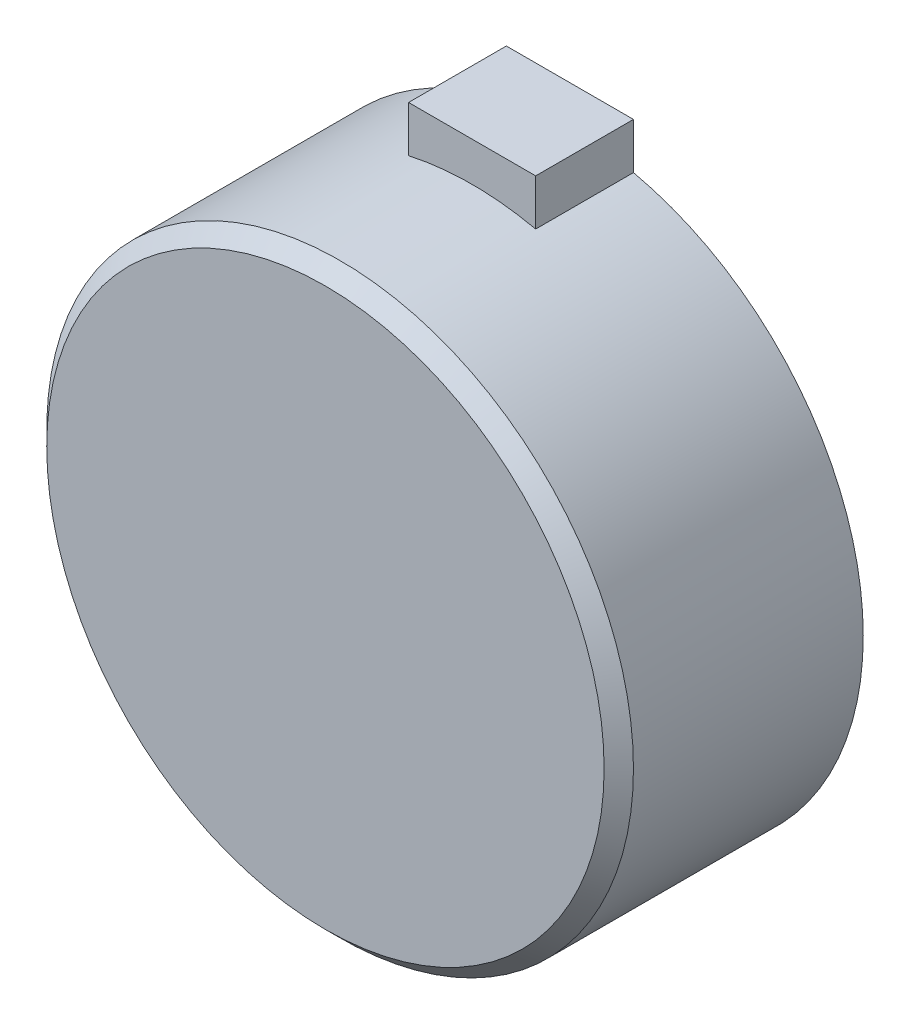
ISO-10303-21;
HEADER;
FILE_DESCRIPTION(('STEP AP214'),'2;1');
FILE_NAME('part.step','',(''),(''),'','','');
FILE_SCHEMA(('AUTOMOTIVE_DESIGN { 1 0 10303 214 1 1 1 1 }'));
ENDSEC;
DATA;
#1=APPLICATION_CONTEXT('core data for automotive mechanical design processes');
#2=APPLICATION_PROTOCOL_DEFINITION('international standard','automotive_design',2000,#1);
#3=PRODUCT_CONTEXT('',#1,'mechanical');
#4=PRODUCT('Part','Part','',(#3));
#5=PRODUCT_RELATED_PRODUCT_CATEGORY('part','',(#4));
#6=PRODUCT_DEFINITION_FORMATION('','',#4);
#7=PRODUCT_DEFINITION_CONTEXT('part definition',#1,'design');
#8=PRODUCT_DEFINITION('design','',#6,#7);
#9=PRODUCT_DEFINITION_SHAPE('','',#8);
#10=(LENGTH_UNIT() NAMED_UNIT(*) SI_UNIT(.MILLI.,.METRE.));
#11=(NAMED_UNIT(*) PLANE_ANGLE_UNIT() SI_UNIT($,.RADIAN.));
#12=(NAMED_UNIT(*) SI_UNIT($,.STERADIAN.) SOLID_ANGLE_UNIT());
#13=UNCERTAINTY_MEASURE_WITH_UNIT(LENGTH_MEASURE(1.E-05),#10,'distance_accuracy_value','');
#14=(GEOMETRIC_REPRESENTATION_CONTEXT(3) GLOBAL_UNCERTAINTY_ASSIGNED_CONTEXT((#13)) GLOBAL_UNIT_ASSIGNED_CONTEXT((#10,
#11,#12)) REPRESENTATION_CONTEXT('',''));
#15=CARTESIAN_POINT('',(0.,0.,0.));
#16=DIRECTION('',(0.,0.,1.));
#17=DIRECTION('',(1.,0.,0.));
#18=AXIS2_PLACEMENT_3D('',#15,#16,#17);
#19=CARTESIAN_POINT('',(0.,0.,10.));
#20=DIRECTION('',(0.,0.,1.));
#21=DIRECTION('',(1.,0.,0.));
#22=AXIS2_PLACEMENT_3D('',#19,#20,#21);
#23=CYLINDRICAL_SURFACE('',#22,60.);
#24=CARTESIAN_POINT('',(0.,0.,-3.));
#25=DIRECTION('',(0.,0.,1.));
#26=DIRECTION('',(1.,0.,0.));
#27=AXIS2_PLACEMENT_3D('',#24,#25,#26);
#28=CIRCLE('',#27,60.);
#29=CARTESIAN_POINT('',(60.,0.,-3.));
#30=VERTEX_POINT('',#29);
#31=EDGE_CURVE('E161',#30,#30,#28,.T.);
#32=ORIENTED_EDGE('',*,*,#31,.F.);
#33=EDGE_LOOP('',(#32));
#34=FACE_BOUND('',#33,.T.);
#35=CARTESIAN_POINT('',(0.,0.,-30.));
#36=DIRECTION('',(0.,0.,1.));
#37=DIRECTION('',(1.,0.,0.));
#38=AXIS2_PLACEMENT_3D('',#35,#36,#37);
#39=CIRCLE('',#38,60.);
#40=CARTESIAN_POINT('',(-13.,58.5747385824299,-30.));
#41=VERTEX_POINT('',#40);
#42=CARTESIAN_POINT('',(13.,58.5747385824299,-30.));
#43=VERTEX_POINT('',#42);
#44=EDGE_CURVE('E11',#41,#43,#39,.F.);
#45=ORIENTED_EDGE('',*,*,#44,.F.);
#46=DIRECTION('',(0.,0.,1.));
#47=VECTOR('',#46,1.);
#48=CARTESIAN_POINT('',(-13.,58.5747385824299,10.));
#49=LINE('',#48,#47);
#50=CARTESIAN_POINT('',(-13.,58.5747385824299,-50.));
#51=VERTEX_POINT('',#50);
#52=EDGE_CURVE('E57',#41,#51,#49,.F.);
#53=ORIENTED_EDGE('',*,*,#52,.T.);
#54=CARTESIAN_POINT('',(0.,0.,-50.));
#55=DIRECTION('',(0.,0.,1.));
#56=DIRECTION('',(1.,0.,0.));
#57=AXIS2_PLACEMENT_3D('',#54,#55,#56);
#58=CIRCLE('',#57,60.);
#59=CARTESIAN_POINT('',(13.,58.5747385824299,-50.));
#60=VERTEX_POINT('',#59);
#61=EDGE_CURVE('E160',#51,#60,#58,.T.);
#62=ORIENTED_EDGE('',*,*,#61,.T.);
#63=DIRECTION('',(0.,0.,1.));
#64=VECTOR('',#63,1.);
#65=CARTESIAN_POINT('',(13.,58.5747385824299,10.));
#66=LINE('',#65,#64);
#67=EDGE_CURVE('E91',#60,#43,#66,.T.);
#68=ORIENTED_EDGE('',*,*,#67,.T.);
#69=EDGE_LOOP('',(#45,#53,#62,#68));
#70=FACE_BOUND('',#69,.T.);
#71=ADVANCED_FACE('F39',(#34,#70),#23,.T.);
#72=CARTESIAN_POINT('',(0.,0.,0.));
#73=DIRECTION('',(0.,0.,1.));
#74=DIRECTION('',(1.,0.,0.));
#75=AXIS2_PLACEMENT_3D('',#72,#73,#74);
#76=PLANE('',#75);
#77=CARTESIAN_POINT('',(0.,0.,0.));
#78=DIRECTION('',(0.,0.,1.));
#79=DIRECTION('',(1.,0.,0.));
#80=AXIS2_PLACEMENT_3D('',#77,#78,#79);
#81=CIRCLE('',#80,57.);
#82=CARTESIAN_POINT('',(57.,0.,0.));
#83=VERTEX_POINT('',#82);
#84=EDGE_CURVE('E50',#83,#83,#81,.T.);
#85=ORIENTED_EDGE('',*,*,#84,.T.);
#86=EDGE_LOOP('',(#85));
#87=FACE_BOUND('',#86,.T.);
#88=ADVANCED_FACE('F41',(#87),#76,.T.);
#89=CARTESIAN_POINT('',(0.,0.,0.));
#90=DIRECTION('',(0.,0.,-1.));
#91=DIRECTION('',(-1.,0.,0.));
#92=AXIS2_PLACEMENT_3D('',#89,#90,#91);
#93=CONICAL_SURFACE('',#92,57.,0.785398163397449);
#94=ORIENTED_EDGE('',*,*,#31,.T.);
#95=EDGE_LOOP('',(#94));
#96=FACE_BOUND('',#95,.T.);
#97=ORIENTED_EDGE('',*,*,#84,.F.);
#98=EDGE_LOOP('',(#97));
#99=FACE_BOUND('',#98,.T.);
#100=ADVANCED_FACE('F170',(#96,#99),#93,.T.);
#101=CARTESIAN_POINT('',(57.,0.,-50.));
#102=DIRECTION('',(0.,0.,-1.));
#103=DIRECTION('',(-1.,0.,0.));
#104=AXIS2_PLACEMENT_3D('',#101,#102,#103);
#105=PLANE('',#104);
#106=ORIENTED_EDGE('',*,*,#61,.F.);
#107=DIRECTION('',(0.,-1.,0.));
#108=VECTOR('',#107,1.);
#109=CARTESIAN_POINT('',(-13.,68.,-50.));
#110=LINE('',#109,#108);
#111=CARTESIAN_POINT('',(-13.,68.,-50.));
#112=VERTEX_POINT('',#111);
#113=EDGE_CURVE('E103',#112,#51,#110,.T.);
#114=ORIENTED_EDGE('',*,*,#113,.F.);
#115=DIRECTION('',(-1.,0.,0.));
#116=VECTOR('',#115,1.);
#117=CARTESIAN_POINT('',(13.,68.,-50.));
#118=LINE('',#117,#116);
#119=CARTESIAN_POINT('',(13.,68.,-50.));
#120=VERTEX_POINT('',#119);
#121=EDGE_CURVE('E110',#120,#112,#118,.T.);
#122=ORIENTED_EDGE('',*,*,#121,.F.);
#123=DIRECTION('',(0.,1.,0.));
#124=VECTOR('',#123,1.);
#125=CARTESIAN_POINT('',(13.,56.,-50.));
#126=LINE('',#125,#124);
#127=EDGE_CURVE('E89',#60,#120,#126,.T.);
#128=ORIENTED_EDGE('',*,*,#127,.F.);
#129=EDGE_LOOP('',(#106,#114,#122,#128));
#130=FACE_BOUND('',#129,.T.);
#131=CARTESIAN_POINT('',(0.,50.,-50.));
#132=DIRECTION('',(0.,0.,1.));
#133=DIRECTION('',(0.,1.,0.));
#134=AXIS2_PLACEMENT_3D('',#131,#132,#133);
#135=CIRCLE('',#134,2.1);
#136=CARTESIAN_POINT('',(0.,52.1,-50.));
#137=VERTEX_POINT('',#136);
#138=EDGE_CURVE('E126',#137,#137,#135,.T.);
#139=ORIENTED_EDGE('',*,*,#138,.T.);
#140=EDGE_LOOP('',(#139));
#141=FACE_BOUND('',#140,.T.);
#142=CARTESIAN_POINT('',(-35.3553390593274,35.3553390593274,-50.));
#143=DIRECTION('',(0.,0.,1.));
#144=DIRECTION('',(-0.707106781186547,0.707106781186548,0.));
#145=AXIS2_PLACEMENT_3D('',#142,#143,#144);
#146=CIRCLE('',#145,2.1);
#147=CARTESIAN_POINT('',(-36.8402632998191,36.8402632998191,-50.));
#148=VERTEX_POINT('',#147);
#149=EDGE_CURVE('E133',#148,#148,#146,.T.);
#150=ORIENTED_EDGE('',*,*,#149,.T.);
#151=EDGE_LOOP('',(#150));
#152=FACE_BOUND('',#151,.T.);
#153=CARTESIAN_POINT('',(-50.,0.,-50.));
#154=DIRECTION('',(0.,0.,1.));
#155=DIRECTION('',(-1.,0.,0.));
#156=AXIS2_PLACEMENT_3D('',#153,#154,#155);
#157=CIRCLE('',#156,2.1);
#158=CARTESIAN_POINT('',(-52.1,0.,-50.));
#159=VERTEX_POINT('',#158);
#160=EDGE_CURVE('E140',#159,#159,#157,.T.);
#161=ORIENTED_EDGE('',*,*,#160,.T.);
#162=EDGE_LOOP('',(#161));
#163=FACE_BOUND('',#162,.T.);
#164=CARTESIAN_POINT('',(-35.3553390593274,-35.3553390593274,-50.));
#165=DIRECTION('',(0.,0.,1.));
#166=DIRECTION('',(-0.707106781186548,-0.707106781186547,0.));
#167=AXIS2_PLACEMENT_3D('',#164,#165,#166);
#168=CIRCLE('',#167,2.1);
#169=CARTESIAN_POINT('',(-36.8402632998191,-36.8402632998191,-50.));
#170=VERTEX_POINT('',#169);
#171=EDGE_CURVE('E113',#170,#170,#168,.T.);
#172=ORIENTED_EDGE('',*,*,#171,.T.);
#173=EDGE_LOOP('',(#172));
#174=FACE_BOUND('',#173,.T.);
#175=CARTESIAN_POINT('',(0.,-50.,-50.));
#176=DIRECTION('',(0.,0.,1.));
#177=DIRECTION('',(0.,-1.,0.));
#178=AXIS2_PLACEMENT_3D('',#175,#176,#177);
#179=CIRCLE('',#178,2.1);
#180=CARTESIAN_POINT('',(0.,-52.1,-50.));
#181=VERTEX_POINT('',#180);
#182=EDGE_CURVE('E119',#181,#181,#179,.T.);
#183=ORIENTED_EDGE('',*,*,#182,.T.);
#184=EDGE_LOOP('',(#183));
#185=FACE_BOUND('',#184,.T.);
#186=CARTESIAN_POINT('',(35.3553390593274,-35.3553390593274,-50.));
#187=DIRECTION('',(0.,0.,1.));
#188=DIRECTION('',(0.707106781186547,-0.707106781186548,0.));
#189=AXIS2_PLACEMENT_3D('',#186,#187,#188);
#190=CIRCLE('',#189,2.1);
#191=CARTESIAN_POINT('',(36.8402632998191,-36.8402632998191,-50.));
#192=VERTEX_POINT('',#191);
#193=EDGE_CURVE('E112',#192,#192,#190,.T.);
#194=ORIENTED_EDGE('',*,*,#193,.T.);
#195=EDGE_LOOP('',(#194));
#196=FACE_BOUND('',#195,.T.);
#197=CARTESIAN_POINT('',(35.3553390593274,35.3553390593274,-50.));
#198=DIRECTION('',(0.,0.,1.));
#199=DIRECTION('',(0.707106781186548,0.707106781186548,0.));
#200=AXIS2_PLACEMENT_3D('',#197,#198,#199);
#201=CIRCLE('',#200,2.1);
#202=CARTESIAN_POINT('',(36.8402632998191,36.8402632998191,-50.));
#203=VERTEX_POINT('',#202);
#204=EDGE_CURVE('E130',#203,#203,#201,.T.);
#205=ORIENTED_EDGE('',*,*,#204,.T.);
#206=EDGE_LOOP('',(#205));
#207=FACE_BOUND('',#206,.T.);
#208=CARTESIAN_POINT('',(50.,0.,-50.));
#209=DIRECTION('',(0.,0.,1.));
#210=DIRECTION('',(1.,0.,0.));
#211=AXIS2_PLACEMENT_3D('',#208,#209,#210);
#212=CIRCLE('',#211,2.1);
#213=CARTESIAN_POINT('',(52.1,0.,-50.));
#214=VERTEX_POINT('',#213);
#215=EDGE_CURVE('E151',#214,#214,#212,.T.);
#216=ORIENTED_EDGE('',*,*,#215,.T.);
#217=EDGE_LOOP('',(#216));
#218=FACE_BOUND('',#217,.T.);
#219=ADVANCED_FACE('F166',(#130,#141,#152,#163,#174,#185,#196,#207,#218),#105,.T.);
#220=CARTESIAN_POINT('',(50.,0.,-42.));
#221=DIRECTION('',(0.,0.,-1.));
#222=DIRECTION('',(-1.,0.,0.));
#223=AXIS2_PLACEMENT_3D('',#220,#221,#222);
#224=CYLINDRICAL_SURFACE('',#223,2.1);
#225=CARTESIAN_POINT('',(50.,0.,-42.));
#226=DIRECTION('',(0.,0.,1.));
#227=DIRECTION('',(1.,0.,0.));
#228=AXIS2_PLACEMENT_3D('',#225,#226,#227);
#229=CIRCLE('',#228,2.1);
#230=CARTESIAN_POINT('',(52.1,0.,-42.));
#231=VERTEX_POINT('',#230);
#232=EDGE_CURVE('E152',#231,#231,#229,.T.);
#233=ORIENTED_EDGE('',*,*,#232,.T.);
#234=EDGE_LOOP('',(#233));
#235=FACE_BOUND('',#234,.T.);
#236=ORIENTED_EDGE('',*,*,#215,.F.);
#237=EDGE_LOOP('',(#236));
#238=FACE_BOUND('',#237,.T.);
#239=ADVANCED_FACE('F176',(#235,#238),#224,.F.);
#240=CARTESIAN_POINT('',(50.,0.,-42.));
#241=DIRECTION('',(0.,0.,1.));
#242=DIRECTION('',(1.,0.,0.));
#243=AXIS2_PLACEMENT_3D('',#240,#241,#242);
#244=PLANE('',#243);
#245=ORIENTED_EDGE('',*,*,#232,.F.);
#246=EDGE_LOOP('',(#245));
#247=FACE_BOUND('',#246,.T.);
#248=ADVANCED_FACE('F190',(#247),#244,.F.);
#249=CARTESIAN_POINT('',(35.3553390593274,35.3553390593274,-42.));
#250=DIRECTION('',(0.,0.,-1.));
#251=DIRECTION('',(-1.,0.,0.));
#252=AXIS2_PLACEMENT_3D('',#249,#250,#251);
#253=CYLINDRICAL_SURFACE('',#252,2.1);
#254=CARTESIAN_POINT('',(35.3553390593274,35.3553390593274,-42.));
#255=DIRECTION('',(0.,0.,1.));
#256=DIRECTION('',(0.707106781186548,0.707106781186548,0.));
#257=AXIS2_PLACEMENT_3D('',#254,#255,#256);
#258=CIRCLE('',#257,2.1);
#259=CARTESIAN_POINT('',(36.8402632998191,36.8402632998191,-42.));
#260=VERTEX_POINT('',#259);
#261=EDGE_CURVE('E146',#260,#260,#258,.T.);
#262=ORIENTED_EDGE('',*,*,#261,.T.);
#263=EDGE_LOOP('',(#262));
#264=FACE_BOUND('',#263,.T.);
#265=ORIENTED_EDGE('',*,*,#204,.F.);
#266=EDGE_LOOP('',(#265));
#267=FACE_BOUND('',#266,.T.);
#268=ADVANCED_FACE('F192',(#264,#267),#253,.F.);
#269=CARTESIAN_POINT('',(35.3553390593274,35.3553390593274,-42.));
#270=DIRECTION('',(0.,0.,1.));
#271=DIRECTION('',(0.707106781186548,0.707106781186548,0.));
#272=AXIS2_PLACEMENT_3D('',#269,#270,#271);
#273=PLANE('',#272);
#274=ORIENTED_EDGE('',*,*,#261,.F.);
#275=EDGE_LOOP('',(#274));
#276=FACE_BOUND('',#275,.T.);
#277=ADVANCED_FACE('F198',(#276),#273,.F.);
#278=CARTESIAN_POINT('',(35.3553390593274,-35.3553390593274,-42.));
#279=DIRECTION('',(0.,0.,-1.));
#280=DIRECTION('',(-1.,0.,0.));
#281=AXIS2_PLACEMENT_3D('',#278,#279,#280);
#282=CYLINDRICAL_SURFACE('',#281,2.1);
#283=CARTESIAN_POINT('',(35.3553390593274,-35.3553390593274,-42.));
#284=DIRECTION('',(0.,0.,1.));
#285=DIRECTION('',(0.707106781186547,-0.707106781186548,0.));
#286=AXIS2_PLACEMENT_3D('',#283,#284,#285);
#287=CIRCLE('',#286,2.1);
#288=CARTESIAN_POINT('',(36.8402632998191,-36.8402632998191,-42.));
#289=VERTEX_POINT('',#288);
#290=EDGE_CURVE('E118',#289,#289,#287,.T.);
#291=ORIENTED_EDGE('',*,*,#290,.T.);
#292=EDGE_LOOP('',(#291));
#293=FACE_BOUND('',#292,.T.);
#294=ORIENTED_EDGE('',*,*,#193,.F.);
#295=EDGE_LOOP('',(#294));
#296=FACE_BOUND('',#295,.T.);
#297=ADVANCED_FACE('F199',(#293,#296),#282,.F.);
#298=CARTESIAN_POINT('',(35.3553390593274,-35.3553390593274,-42.));
#299=DIRECTION('',(0.,0.,1.));
#300=DIRECTION('',(0.707106781186547,-0.707106781186548,0.));
#301=AXIS2_PLACEMENT_3D('',#298,#299,#300);
#302=PLANE('',#301);
#303=ORIENTED_EDGE('',*,*,#290,.F.);
#304=EDGE_LOOP('',(#303));
#305=FACE_BOUND('',#304,.T.);
#306=ADVANCED_FACE('F240',(#305),#302,.F.);
#307=CARTESIAN_POINT('',(0.,-50.,-42.));
#308=DIRECTION('',(0.,0.,-1.));
#309=DIRECTION('',(-1.,0.,0.));
#310=AXIS2_PLACEMENT_3D('',#307,#308,#309);
#311=CYLINDRICAL_SURFACE('',#310,2.1);
#312=CARTESIAN_POINT('',(0.,-50.,-42.));
#313=DIRECTION('',(0.,0.,1.));
#314=DIRECTION('',(0.,-1.,0.));
#315=AXIS2_PLACEMENT_3D('',#312,#313,#314);
#316=CIRCLE('',#315,2.1);
#317=CARTESIAN_POINT('',(0.,-52.1,-42.));
#318=VERTEX_POINT('',#317);
#319=EDGE_CURVE('E115',#318,#318,#316,.T.);
#320=ORIENTED_EDGE('',*,*,#319,.T.);
#321=EDGE_LOOP('',(#320));
#322=FACE_BOUND('',#321,.T.);
#323=ORIENTED_EDGE('',*,*,#182,.F.);
#324=EDGE_LOOP('',(#323));
#325=FACE_BOUND('',#324,.T.);
#326=ADVANCED_FACE('F244',(#322,#325),#311,.F.);
#327=CARTESIAN_POINT('',(0.,-50.,-42.));
#328=DIRECTION('',(0.,0.,1.));
#329=DIRECTION('',(0.,-1.,0.));
#330=AXIS2_PLACEMENT_3D('',#327,#328,#329);
#331=PLANE('',#330);
#332=ORIENTED_EDGE('',*,*,#319,.F.);
#333=EDGE_LOOP('',(#332));
#334=FACE_BOUND('',#333,.T.);
#335=ADVANCED_FACE('F206',(#334),#331,.F.);
#336=CARTESIAN_POINT('',(-35.3553390593274,-35.3553390593274,-42.));
#337=DIRECTION('',(0.,0.,-1.));
#338=DIRECTION('',(-1.,0.,0.));
#339=AXIS2_PLACEMENT_3D('',#336,#337,#338);
#340=CYLINDRICAL_SURFACE('',#339,2.1);
#341=CARTESIAN_POINT('',(-35.3553390593274,-35.3553390593274,-42.));
#342=DIRECTION('',(0.,0.,1.));
#343=DIRECTION('',(-0.707106781186548,-0.707106781186547,0.));
#344=AXIS2_PLACEMENT_3D('',#341,#342,#343);
#345=CIRCLE('',#344,2.1);
#346=CARTESIAN_POINT('',(-36.8402632998191,-36.8402632998191,-42.));
#347=VERTEX_POINT('',#346);
#348=EDGE_CURVE('E141',#347,#347,#345,.T.);
#349=ORIENTED_EDGE('',*,*,#348,.T.);
#350=EDGE_LOOP('',(#349));
#351=FACE_BOUND('',#350,.T.);
#352=ORIENTED_EDGE('',*,*,#171,.F.);
#353=EDGE_LOOP('',(#352));
#354=FACE_BOUND('',#353,.T.);
#355=ADVANCED_FACE('F205',(#351,#354),#340,.F.);
#356=CARTESIAN_POINT('',(-35.3553390593274,-35.3553390593274,-42.));
#357=DIRECTION('',(0.,0.,1.));
#358=DIRECTION('',(-0.707106781186548,-0.707106781186547,0.));
#359=AXIS2_PLACEMENT_3D('',#356,#357,#358);
#360=PLANE('',#359);
#361=ORIENTED_EDGE('',*,*,#348,.F.);
#362=EDGE_LOOP('',(#361));
#363=FACE_BOUND('',#362,.T.);
#364=ADVANCED_FACE('F202',(#363),#360,.F.);
#365=CARTESIAN_POINT('',(-50.,0.,-42.));
#366=DIRECTION('',(0.,0.,-1.));
#367=DIRECTION('',(-1.,0.,0.));
#368=AXIS2_PLACEMENT_3D('',#365,#366,#367);
#369=CYLINDRICAL_SURFACE('',#368,2.1);
#370=CARTESIAN_POINT('',(-50.,0.,-42.));
#371=DIRECTION('',(0.,0.,1.));
#372=DIRECTION('',(-1.,0.,0.));
#373=AXIS2_PLACEMENT_3D('',#370,#371,#372);
#374=CIRCLE('',#373,2.1);
#375=CARTESIAN_POINT('',(-52.1,0.,-42.));
#376=VERTEX_POINT('',#375);
#377=EDGE_CURVE('E137',#376,#376,#374,.T.);
#378=ORIENTED_EDGE('',*,*,#377,.T.);
#379=EDGE_LOOP('',(#378));
#380=FACE_BOUND('',#379,.T.);
#381=ORIENTED_EDGE('',*,*,#160,.F.);
#382=EDGE_LOOP('',(#381));
#383=FACE_BOUND('',#382,.T.);
#384=ADVANCED_FACE('F209',(#380,#383),#369,.F.);
#385=CARTESIAN_POINT('',(-50.,0.,-42.));
#386=DIRECTION('',(0.,0.,1.));
#387=DIRECTION('',(-1.,0.,0.));
#388=AXIS2_PLACEMENT_3D('',#385,#386,#387);
#389=PLANE('',#388);
#390=ORIENTED_EDGE('',*,*,#377,.F.);
#391=EDGE_LOOP('',(#390));
#392=FACE_BOUND('',#391,.T.);
#393=ADVANCED_FACE('F212',(#392),#389,.F.);
#394=CARTESIAN_POINT('',(-35.3553390593274,35.3553390593274,-42.));
#395=DIRECTION('',(0.,0.,-1.));
#396=DIRECTION('',(-1.,0.,0.));
#397=AXIS2_PLACEMENT_3D('',#394,#395,#396);
#398=CYLINDRICAL_SURFACE('',#397,2.1);
#399=CARTESIAN_POINT('',(-35.3553390593274,35.3553390593274,-42.));
#400=DIRECTION('',(0.,0.,1.));
#401=DIRECTION('',(-0.707106781186547,0.707106781186548,0.));
#402=AXIS2_PLACEMENT_3D('',#399,#400,#401);
#403=CIRCLE('',#402,2.1);
#404=CARTESIAN_POINT('',(-36.8402632998191,36.8402632998191,-42.));
#405=VERTEX_POINT('',#404);
#406=EDGE_CURVE('E134',#405,#405,#403,.T.);
#407=ORIENTED_EDGE('',*,*,#406,.T.);
#408=EDGE_LOOP('',(#407));
#409=FACE_BOUND('',#408,.T.);
#410=ORIENTED_EDGE('',*,*,#149,.F.);
#411=EDGE_LOOP('',(#410));
#412=FACE_BOUND('',#411,.T.);
#413=ADVANCED_FACE('F217',(#409,#412),#398,.F.);
#414=CARTESIAN_POINT('',(-35.3553390593274,35.3553390593274,-42.));
#415=DIRECTION('',(0.,0.,1.));
#416=DIRECTION('',(-0.707106781186547,0.707106781186548,0.));
#417=AXIS2_PLACEMENT_3D('',#414,#415,#416);
#418=PLANE('',#417);
#419=ORIENTED_EDGE('',*,*,#406,.F.);
#420=EDGE_LOOP('',(#419));
#421=FACE_BOUND('',#420,.T.);
#422=ADVANCED_FACE('F225',(#421),#418,.F.);
#423=CARTESIAN_POINT('',(0.,50.,-42.));
#424=DIRECTION('',(0.,0.,-1.));
#425=DIRECTION('',(-1.,0.,0.));
#426=AXIS2_PLACEMENT_3D('',#423,#424,#425);
#427=CYLINDRICAL_SURFACE('',#426,2.1);
#428=CARTESIAN_POINT('',(0.,50.,-42.));
#429=DIRECTION('',(0.,0.,1.));
#430=DIRECTION('',(0.,1.,0.));
#431=AXIS2_PLACEMENT_3D('',#428,#429,#430);
#432=CIRCLE('',#431,2.1);
#433=CARTESIAN_POINT('',(0.,52.1,-42.));
#434=VERTEX_POINT('',#433);
#435=EDGE_CURVE('E123',#434,#434,#432,.T.);
#436=ORIENTED_EDGE('',*,*,#435,.T.);
#437=EDGE_LOOP('',(#436));
#438=FACE_BOUND('',#437,.T.);
#439=ORIENTED_EDGE('',*,*,#138,.F.);
#440=EDGE_LOOP('',(#439));
#441=FACE_BOUND('',#440,.T.);
#442=ADVANCED_FACE('F229',(#438,#441),#427,.F.);
#443=CARTESIAN_POINT('',(0.,50.,-42.));
#444=DIRECTION('',(0.,0.,1.));
#445=DIRECTION('',(0.,1.,0.));
#446=AXIS2_PLACEMENT_3D('',#443,#444,#445);
#447=PLANE('',#446);
#448=ORIENTED_EDGE('',*,*,#435,.F.);
#449=EDGE_LOOP('',(#448));
#450=FACE_BOUND('',#449,.T.);
#451=ADVANCED_FACE('F227',(#450),#447,.F.);
#452=CARTESIAN_POINT('',(-13.,68.,-30.));
#453=DIRECTION('',(1.,0.,0.));
#454=DIRECTION('',(0.,0.,-1.));
#455=AXIS2_PLACEMENT_3D('',#452,#453,#454);
#456=PLANE('',#455);
#457=ORIENTED_EDGE('',*,*,#52,.F.);
#458=DIRECTION('',(0.,-1.,0.));
#459=VECTOR('',#458,1.);
#460=CARTESIAN_POINT('',(-13.,68.,-30.));
#461=LINE('',#460,#459);
#462=CARTESIAN_POINT('',(-13.,68.,-30.));
#463=VERTEX_POINT('',#462);
#464=EDGE_CURVE('E83',#463,#41,#461,.T.);
#465=ORIENTED_EDGE('',*,*,#464,.F.);
#466=DIRECTION('',(0.,0.,-1.));
#467=VECTOR('',#466,1.);
#468=CARTESIAN_POINT('',(-13.,68.,-30.));
#469=LINE('',#468,#467);
#470=EDGE_CURVE('E94',#463,#112,#469,.T.);
#471=ORIENTED_EDGE('',*,*,#470,.T.);
#472=ORIENTED_EDGE('',*,*,#113,.T.);
#473=EDGE_LOOP('',(#457,#465,#471,#472));
#474=FACE_BOUND('',#473,.T.);
#475=ADVANCED_FACE('F234',(#474),#456,.F.);
#476=CARTESIAN_POINT('',(13.,56.,-30.));
#477=DIRECTION('',(-1.,0.,0.));
#478=DIRECTION('',(0.,0.,1.));
#479=AXIS2_PLACEMENT_3D('',#476,#477,#478);
#480=PLANE('',#479);
#481=ORIENTED_EDGE('',*,*,#67,.F.);
#482=ORIENTED_EDGE('',*,*,#127,.T.);
#483=DIRECTION('',(0.,0.,-1.));
#484=VECTOR('',#483,1.);
#485=CARTESIAN_POINT('',(13.,68.,-30.));
#486=LINE('',#485,#484);
#487=CARTESIAN_POINT('',(13.,68.,-30.));
#488=VERTEX_POINT('',#487);
#489=EDGE_CURVE('E87',#488,#120,#486,.T.);
#490=ORIENTED_EDGE('',*,*,#489,.F.);
#491=DIRECTION('',(0.,1.,0.));
#492=VECTOR('',#491,1.);
#493=CARTESIAN_POINT('',(13.,56.,-30.));
#494=LINE('',#493,#492);
#495=EDGE_CURVE('E73',#43,#488,#494,.T.);
#496=ORIENTED_EDGE('',*,*,#495,.F.);
#497=EDGE_LOOP('',(#481,#482,#490,#496));
#498=FACE_BOUND('',#497,.T.);
#499=ADVANCED_FACE('F86',(#498),#480,.F.);
#500=CARTESIAN_POINT('',(13.,68.,-30.));
#501=DIRECTION('',(0.,-1.,0.));
#502=DIRECTION('',(0.,0.,-1.));
#503=AXIS2_PLACEMENT_3D('',#500,#501,#502);
#504=PLANE('',#503);
#505=ORIENTED_EDGE('',*,*,#121,.T.);
#506=ORIENTED_EDGE('',*,*,#470,.F.);
#507=DIRECTION('',(-1.,0.,0.));
#508=VECTOR('',#507,1.);
#509=CARTESIAN_POINT('',(13.,68.,-30.));
#510=LINE('',#509,#508);
#511=EDGE_CURVE('E77',#488,#463,#510,.T.);
#512=ORIENTED_EDGE('',*,*,#511,.F.);
#513=ORIENTED_EDGE('',*,*,#489,.T.);
#514=EDGE_LOOP('',(#505,#506,#512,#513));
#515=FACE_BOUND('',#514,.T.);
#516=ADVANCED_FACE('F96',(#515),#504,.F.);
#517=CARTESIAN_POINT('',(0.,0.,-30.));
#518=DIRECTION('',(0.,0.,1.));
#519=DIRECTION('',(1.,0.,0.));
#520=AXIS2_PLACEMENT_3D('',#517,#518,#519);
#521=PLANE('',#520);
#522=ORIENTED_EDGE('',*,*,#464,.T.);
#523=ORIENTED_EDGE('',*,*,#44,.T.);
#524=ORIENTED_EDGE('',*,*,#495,.T.);
#525=ORIENTED_EDGE('',*,*,#511,.T.);
#526=EDGE_LOOP('',(#522,#523,#524,#525));
#527=FACE_BOUND('',#526,.T.);
#528=ADVANCED_FACE('F80',(#527),#521,.T.);
#529=CLOSED_SHELL('',(#71,#88,#100,#219,#239,#248,#268,#277,#297,#306,#326,#335,#355,#364,#384,
#393,#413,#422,#442,#451,#475,#499,#516,#528));
#530=MANIFOLD_SOLID_BREP('B2',#529);
#531=ADVANCED_BREP_SHAPE_REPRESENTATION('',(#18,#530),#14);
#532=SHAPE_DEFINITION_REPRESENTATION(#9,#531);
ENDSEC;
END-ISO-10303-21;
